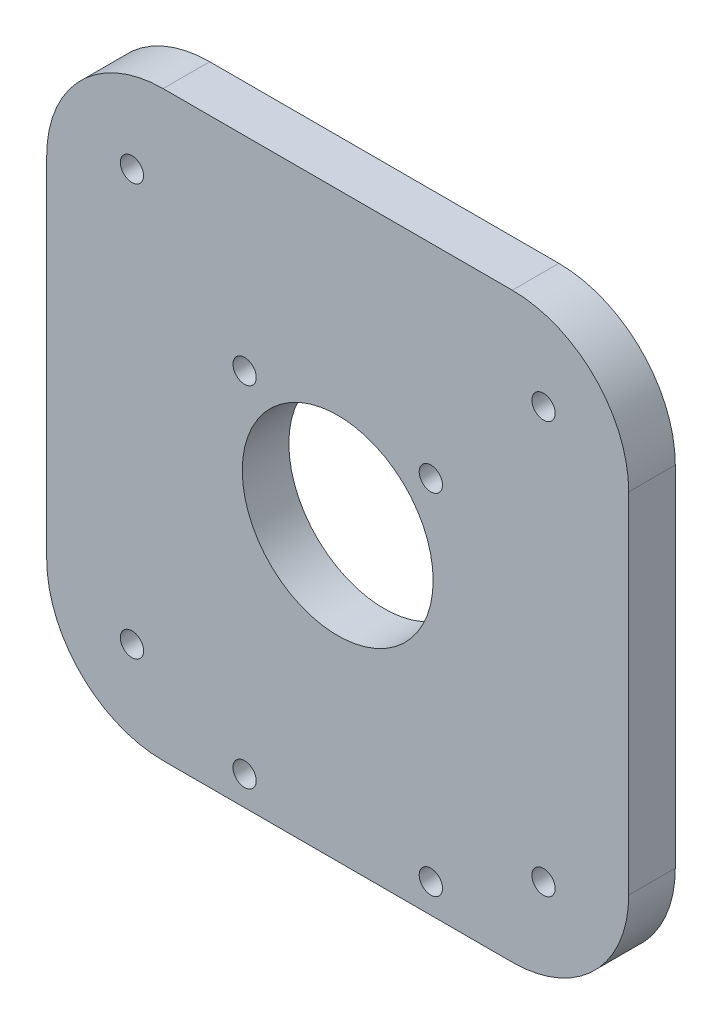
ISO-10303-21;
HEADER;
FILE_DESCRIPTION(('STEP AP214'),'2;1');
FILE_NAME('part.step','',(''),(''),'','','');
FILE_SCHEMA(('AUTOMOTIVE_DESIGN { 1 0 10303 214 1 1 1 1 }'));
ENDSEC;
DATA;
#1=APPLICATION_CONTEXT('core data for automotive mechanical design processes');
#2=APPLICATION_PROTOCOL_DEFINITION('international standard','automotive_design',2000,#1);
#3=PRODUCT_CONTEXT('',#1,'mechanical');
#4=PRODUCT('Part','Part','',(#3));
#5=PRODUCT_RELATED_PRODUCT_CATEGORY('part','',(#4));
#6=PRODUCT_DEFINITION_FORMATION('','',#4);
#7=PRODUCT_DEFINITION_CONTEXT('part definition',#1,'design');
#8=PRODUCT_DEFINITION('design','',#6,#7);
#9=PRODUCT_DEFINITION_SHAPE('','',#8);
#10=(LENGTH_UNIT() NAMED_UNIT(*) SI_UNIT(.MILLI.,.METRE.));
#11=(NAMED_UNIT(*) PLANE_ANGLE_UNIT() SI_UNIT($,.RADIAN.));
#12=(NAMED_UNIT(*) SI_UNIT($,.STERADIAN.) SOLID_ANGLE_UNIT());
#13=UNCERTAINTY_MEASURE_WITH_UNIT(LENGTH_MEASURE(1.E-05),#10,'distance_accuracy_value','');
#14=(GEOMETRIC_REPRESENTATION_CONTEXT(3) GLOBAL_UNCERTAINTY_ASSIGNED_CONTEXT((#13)) GLOBAL_UNIT_ASSIGNED_CONTEXT((#10,
#11,#12)) REPRESENTATION_CONTEXT('',''));
#15=CARTESIAN_POINT('',(0.,0.,0.));
#16=DIRECTION('',(0.,0.,1.));
#17=DIRECTION('',(1.,0.,0.));
#18=AXIS2_PLACEMENT_3D('',#15,#16,#17);
#19=CARTESIAN_POINT('',(25.,-25.,4.));
#20=DIRECTION('',(-1.,0.,0.));
#21=DIRECTION('',(0.,0.,1.));
#22=AXIS2_PLACEMENT_3D('',#19,#20,#21);
#23=PLANE('',#22);
#24=DIRECTION('',(0.,1.,0.));
#25=VECTOR('',#24,1.);
#26=CARTESIAN_POINT('',(25.,-25.,4.));
#27=LINE('',#26,#25);
#28=CARTESIAN_POINT('',(25.,-15.,4.));
#29=VERTEX_POINT('',#28);
#30=CARTESIAN_POINT('',(25.,15.,4.));
#31=VERTEX_POINT('',#30);
#32=EDGE_CURVE('E140',#29,#31,#27,.T.);
#33=ORIENTED_EDGE('',*,*,#32,.F.);
#34=DIRECTION('',(0.,0.,-1.));
#35=VECTOR('',#34,1.);
#36=CARTESIAN_POINT('',(25.,-15.,4.));
#37=LINE('',#36,#35);
#38=CARTESIAN_POINT('',(25.,-15.,0.));
#39=VERTEX_POINT('',#38);
#40=EDGE_CURVE('E201',#29,#39,#37,.T.);
#41=ORIENTED_EDGE('',*,*,#40,.T.);
#42=DIRECTION('',(0.,1.,0.));
#43=VECTOR('',#42,1.);
#44=CARTESIAN_POINT('',(25.,-25.,0.));
#45=LINE('',#44,#43);
#46=CARTESIAN_POINT('',(25.,15.,0.));
#47=VERTEX_POINT('',#46);
#48=EDGE_CURVE('E172',#39,#47,#45,.T.);
#49=ORIENTED_EDGE('',*,*,#48,.T.);
#50=DIRECTION('',(0.,0.,-1.));
#51=VECTOR('',#50,1.);
#52=CARTESIAN_POINT('',(25.,15.,4.));
#53=LINE('',#52,#51);
#54=EDGE_CURVE('E198',#47,#31,#53,.F.);
#55=ORIENTED_EDGE('',*,*,#54,.T.);
#56=EDGE_LOOP('',(#33,#41,#49,#55));
#57=FACE_BOUND('',#56,.T.);
#58=ADVANCED_FACE('F44',(#57),#23,.F.);
#59=CARTESIAN_POINT('',(-25.,25.,4.));
#60=DIRECTION('',(0.,-1.,0.));
#61=DIRECTION('',(0.,0.,-1.));
#62=AXIS2_PLACEMENT_3D('',#59,#60,#61);
#63=PLANE('',#62);
#64=DIRECTION('',(-1.,0.,0.));
#65=VECTOR('',#64,1.);
#66=CARTESIAN_POINT('',(-25.,25.,4.));
#67=LINE('',#66,#65);
#68=CARTESIAN_POINT('',(15.,25.,4.));
#69=VERTEX_POINT('',#68);
#70=CARTESIAN_POINT('',(-15.,25.,4.));
#71=VERTEX_POINT('',#70);
#72=EDGE_CURVE('E145',#69,#71,#67,.T.);
#73=ORIENTED_EDGE('',*,*,#72,.F.);
#74=DIRECTION('',(0.,0.,-1.));
#75=VECTOR('',#74,1.);
#76=CARTESIAN_POINT('',(15.,25.,4.));
#77=LINE('',#76,#75);
#78=CARTESIAN_POINT('',(15.,25.,0.));
#79=VERTEX_POINT('',#78);
#80=EDGE_CURVE('E11',#69,#79,#77,.T.);
#81=ORIENTED_EDGE('',*,*,#80,.T.);
#82=DIRECTION('',(-1.,0.,0.));
#83=VECTOR('',#82,1.);
#84=CARTESIAN_POINT('',(-25.,25.,0.));
#85=LINE('',#84,#83);
#86=CARTESIAN_POINT('',(-15.,25.,0.));
#87=VERTEX_POINT('',#86);
#88=EDGE_CURVE('E147',#79,#87,#85,.T.);
#89=ORIENTED_EDGE('',*,*,#88,.T.);
#90=DIRECTION('',(0.,0.,-1.));
#91=VECTOR('',#90,1.);
#92=CARTESIAN_POINT('',(-15.,25.,4.));
#93=LINE('',#92,#91);
#94=EDGE_CURVE('E53',#87,#71,#93,.F.);
#95=ORIENTED_EDGE('',*,*,#94,.T.);
#96=EDGE_LOOP('',(#73,#81,#89,#95));
#97=FACE_BOUND('',#96,.T.);
#98=ADVANCED_FACE('F220',(#97),#63,.F.);
#99=CARTESIAN_POINT('',(-25.,-25.,4.));
#100=DIRECTION('',(1.,0.,0.));
#101=DIRECTION('',(0.,0.,-1.));
#102=AXIS2_PLACEMENT_3D('',#99,#100,#101);
#103=PLANE('',#102);
#104=DIRECTION('',(0.,-1.,0.));
#105=VECTOR('',#104,1.);
#106=CARTESIAN_POINT('',(-25.,-25.,0.));
#107=LINE('',#106,#105);
#108=CARTESIAN_POINT('',(-25.,15.,0.));
#109=VERTEX_POINT('',#108);
#110=CARTESIAN_POINT('',(-25.,-15.,0.));
#111=VERTEX_POINT('',#110);
#112=EDGE_CURVE('E141',#109,#111,#107,.T.);
#113=ORIENTED_EDGE('',*,*,#112,.T.);
#114=DIRECTION('',(0.,0.,-1.));
#115=VECTOR('',#114,1.);
#116=CARTESIAN_POINT('',(-25.,-15.,4.));
#117=LINE('',#116,#115);
#118=CARTESIAN_POINT('',(-25.,-15.,4.));
#119=VERTEX_POINT('',#118);
#120=EDGE_CURVE('E116',#111,#119,#117,.F.);
#121=ORIENTED_EDGE('',*,*,#120,.T.);
#122=DIRECTION('',(0.,-1.,0.));
#123=VECTOR('',#122,1.);
#124=CARTESIAN_POINT('',(-25.,-25.,4.));
#125=LINE('',#124,#123);
#126=CARTESIAN_POINT('',(-25.,15.,4.));
#127=VERTEX_POINT('',#126);
#128=EDGE_CURVE('E207',#127,#119,#125,.T.);
#129=ORIENTED_EDGE('',*,*,#128,.F.);
#130=DIRECTION('',(0.,0.,-1.));
#131=VECTOR('',#130,1.);
#132=CARTESIAN_POINT('',(-25.,15.,4.));
#133=LINE('',#132,#131);
#134=EDGE_CURVE('E122',#127,#109,#133,.T.);
#135=ORIENTED_EDGE('',*,*,#134,.T.);
#136=EDGE_LOOP('',(#113,#121,#129,#135));
#137=FACE_BOUND('',#136,.T.);
#138=ADVANCED_FACE('F227',(#137),#103,.F.);
#139=CARTESIAN_POINT('',(-25.,-25.,4.));
#140=DIRECTION('',(0.,1.,0.));
#141=DIRECTION('',(0.,0.,1.));
#142=AXIS2_PLACEMENT_3D('',#139,#140,#141);
#143=PLANE('',#142);
#144=DIRECTION('',(1.,0.,0.));
#145=VECTOR('',#144,1.);
#146=CARTESIAN_POINT('',(-25.,-25.,4.));
#147=LINE('',#146,#145);
#148=CARTESIAN_POINT('',(-15.,-25.,4.));
#149=VERTEX_POINT('',#148);
#150=CARTESIAN_POINT('',(15.,-25.,4.));
#151=VERTEX_POINT('',#150);
#152=EDGE_CURVE('E132',#149,#151,#147,.T.);
#153=ORIENTED_EDGE('',*,*,#152,.F.);
#154=DIRECTION('',(0.,0.,-1.));
#155=VECTOR('',#154,1.);
#156=CARTESIAN_POINT('',(-15.,-25.,4.));
#157=LINE('',#156,#155);
#158=CARTESIAN_POINT('',(-15.,-25.,0.));
#159=VERTEX_POINT('',#158);
#160=EDGE_CURVE('E115',#149,#159,#157,.T.);
#161=ORIENTED_EDGE('',*,*,#160,.T.);
#162=DIRECTION('',(1.,0.,0.));
#163=VECTOR('',#162,1.);
#164=CARTESIAN_POINT('',(-25.,-25.,0.));
#165=LINE('',#164,#163);
#166=CARTESIAN_POINT('',(15.,-25.,0.));
#167=VERTEX_POINT('',#166);
#168=EDGE_CURVE('E129',#159,#167,#165,.T.);
#169=ORIENTED_EDGE('',*,*,#168,.T.);
#170=DIRECTION('',(0.,0.,-1.));
#171=VECTOR('',#170,1.);
#172=CARTESIAN_POINT('',(15.,-25.,4.));
#173=LINE('',#172,#171);
#174=EDGE_CURVE('E135',#167,#151,#173,.F.);
#175=ORIENTED_EDGE('',*,*,#174,.T.);
#176=EDGE_LOOP('',(#153,#161,#169,#175));
#177=FACE_BOUND('',#176,.T.);
#178=ADVANCED_FACE('F128',(#177),#143,.F.);
#179=CARTESIAN_POINT('',(0.,0.,4.));
#180=DIRECTION('',(0.,0.,-1.));
#181=DIRECTION('',(-1.,0.,0.));
#182=AXIS2_PLACEMENT_3D('',#179,#180,#181);
#183=PLANE('',#182);
#184=CARTESIAN_POINT('',(-17.6776695296637,-17.6776695296637,4.));
#185=DIRECTION('',(0.,0.,1.));
#186=DIRECTION('',(1.,0.,0.));
#187=AXIS2_PLACEMENT_3D('',#184,#185,#186);
#188=CIRCLE('',#187,1.);
#189=CARTESIAN_POINT('',(-16.6776695296637,-17.6776695296637,4.));
#190=VERTEX_POINT('',#189);
#191=EDGE_CURVE('E410',#190,#190,#188,.T.);
#192=ORIENTED_EDGE('',*,*,#191,.F.);
#193=EDGE_LOOP('',(#192));
#194=FACE_BOUND('',#193,.T.);
#195=CARTESIAN_POINT('',(17.6776695296637,-17.6776695296637,4.));
#196=DIRECTION('',(0.,0.,1.));
#197=DIRECTION('',(1.,0.,0.));
#198=AXIS2_PLACEMENT_3D('',#195,#196,#197);
#199=CIRCLE('',#198,1.00000000000001);
#200=CARTESIAN_POINT('',(18.6776695296637,-17.6776695296637,4.));
#201=VERTEX_POINT('',#200);
#202=EDGE_CURVE('E414',#201,#201,#199,.T.);
#203=ORIENTED_EDGE('',*,*,#202,.F.);
#204=EDGE_LOOP('',(#203));
#205=FACE_BOUND('',#204,.T.);
#206=CARTESIAN_POINT('',(17.6776695296637,17.6776695296637,4.));
#207=DIRECTION('',(0.,0.,1.));
#208=DIRECTION('',(1.,0.,0.));
#209=AXIS2_PLACEMENT_3D('',#206,#207,#208);
#210=CIRCLE('',#209,1.);
#211=CARTESIAN_POINT('',(18.6776695296637,17.6776695296637,4.));
#212=VERTEX_POINT('',#211);
#213=EDGE_CURVE('E418',#212,#212,#210,.T.);
#214=ORIENTED_EDGE('',*,*,#213,.F.);
#215=EDGE_LOOP('',(#214));
#216=FACE_BOUND('',#215,.T.);
#217=CARTESIAN_POINT('',(-17.6776695296637,17.6776695296637,4.));
#218=DIRECTION('',(0.,0.,1.));
#219=DIRECTION('',(1.,0.,0.));
#220=AXIS2_PLACEMENT_3D('',#217,#218,#219);
#221=CIRCLE('',#220,1.00000000000001);
#222=CARTESIAN_POINT('',(-16.6776695296637,17.6776695296637,4.));
#223=VERTEX_POINT('',#222);
#224=EDGE_CURVE('E422',#223,#223,#221,.T.);
#225=ORIENTED_EDGE('',*,*,#224,.F.);
#226=EDGE_LOOP('',(#225));
#227=FACE_BOUND('',#226,.T.);
#228=CARTESIAN_POINT('',(8.,-22.5,4.));
#229=DIRECTION('',(0.,0.,1.));
#230=DIRECTION('',(1.,0.,0.));
#231=AXIS2_PLACEMENT_3D('',#228,#229,#230);
#232=CIRCLE('',#231,1.);
#233=CARTESIAN_POINT('',(9.,-22.5,4.));
#234=VERTEX_POINT('',#233);
#235=EDGE_CURVE('E426',#234,#234,#232,.T.);
#236=ORIENTED_EDGE('',*,*,#235,.F.);
#237=EDGE_LOOP('',(#236));
#238=FACE_BOUND('',#237,.T.);
#239=CARTESIAN_POINT('',(-8.,-22.5,4.));
#240=DIRECTION('',(0.,0.,1.));
#241=DIRECTION('',(1.,0.,0.));
#242=AXIS2_PLACEMENT_3D('',#239,#240,#241);
#243=CIRCLE('',#242,1.);
#244=CARTESIAN_POINT('',(-7.,-22.5,4.));
#245=VERTEX_POINT('',#244);
#246=EDGE_CURVE('E430',#245,#245,#243,.T.);
#247=ORIENTED_EDGE('',*,*,#246,.F.);
#248=EDGE_LOOP('',(#247));
#249=FACE_BOUND('',#248,.T.);
#250=CARTESIAN_POINT('',(8.,7.5,4.));
#251=DIRECTION('',(0.,0.,1.));
#252=DIRECTION('',(1.,0.,0.));
#253=AXIS2_PLACEMENT_3D('',#250,#251,#252);
#254=CIRCLE('',#253,1.);
#255=CARTESIAN_POINT('',(9.,7.5,4.));
#256=VERTEX_POINT('',#255);
#257=EDGE_CURVE('E434',#256,#256,#254,.T.);
#258=ORIENTED_EDGE('',*,*,#257,.F.);
#259=EDGE_LOOP('',(#258));
#260=FACE_BOUND('',#259,.T.);
#261=CARTESIAN_POINT('',(-8.,7.5,4.));
#262=DIRECTION('',(0.,0.,1.));
#263=DIRECTION('',(1.,0.,0.));
#264=AXIS2_PLACEMENT_3D('',#261,#262,#263);
#265=CIRCLE('',#264,1.);
#266=CARTESIAN_POINT('',(-7.,7.5,4.));
#267=VERTEX_POINT('',#266);
#268=EDGE_CURVE('E438',#267,#267,#265,.T.);
#269=ORIENTED_EDGE('',*,*,#268,.F.);
#270=EDGE_LOOP('',(#269));
#271=FACE_BOUND('',#270,.T.);
#272=CARTESIAN_POINT('',(0.,0.,4.));
#273=DIRECTION('',(0.,0.,1.));
#274=DIRECTION('',(1.,0.,0.));
#275=AXIS2_PLACEMENT_3D('',#272,#273,#274);
#276=CIRCLE('',#275,8.2);
#277=CARTESIAN_POINT('',(8.2,0.,4.));
#278=VERTEX_POINT('',#277);
#279=EDGE_CURVE('E156',#278,#278,#276,.T.);
#280=ORIENTED_EDGE('',*,*,#279,.F.);
#281=EDGE_LOOP('',(#280));
#282=FACE_BOUND('',#281,.T.);
#283=ORIENTED_EDGE('',*,*,#128,.T.);
#284=CARTESIAN_POINT('',(-15.,-15.,4.));
#285=DIRECTION('',(0.,0.,-1.));
#286=DIRECTION('',(-1.,0.,0.));
#287=AXIS2_PLACEMENT_3D('',#284,#285,#286);
#288=CIRCLE('',#287,10.);
#289=EDGE_CURVE('E195',#119,#149,#288,.F.);
#290=ORIENTED_EDGE('',*,*,#289,.T.);
#291=ORIENTED_EDGE('',*,*,#152,.T.);
#292=CARTESIAN_POINT('',(15.,-15.,4.));
#293=DIRECTION('',(0.,0.,-1.));
#294=DIRECTION('',(-1.,0.,0.));
#295=AXIS2_PLACEMENT_3D('',#292,#293,#294);
#296=CIRCLE('',#295,10.);
#297=EDGE_CURVE('E192',#151,#29,#296,.F.);
#298=ORIENTED_EDGE('',*,*,#297,.T.);
#299=ORIENTED_EDGE('',*,*,#32,.T.);
#300=CARTESIAN_POINT('',(15.,15.,4.));
#301=DIRECTION('',(0.,0.,-1.));
#302=DIRECTION('',(-1.,0.,0.));
#303=AXIS2_PLACEMENT_3D('',#300,#301,#302);
#304=CIRCLE('',#303,10.);
#305=EDGE_CURVE('E66',#31,#69,#304,.F.);
#306=ORIENTED_EDGE('',*,*,#305,.T.);
#307=ORIENTED_EDGE('',*,*,#72,.T.);
#308=CARTESIAN_POINT('',(-15.,15.,4.));
#309=DIRECTION('',(0.,0.,-1.));
#310=DIRECTION('',(-1.,0.,0.));
#311=AXIS2_PLACEMENT_3D('',#308,#309,#310);
#312=CIRCLE('',#311,10.);
#313=EDGE_CURVE('E187',#71,#127,#312,.F.);
#314=ORIENTED_EDGE('',*,*,#313,.T.);
#315=EDGE_LOOP('',(#283,#290,#291,#298,#299,#306,#307,#314));
#316=FACE_BOUND('',#315,.T.);
#317=ADVANCED_FACE('F225',(#194,#205,#216,#227,#238,#249,#260,#271,#282,#316),#183,.F.);
#318=CARTESIAN_POINT('',(0.,0.,0.));
#319=DIRECTION('',(0.,0.,-1.));
#320=DIRECTION('',(-1.,0.,0.));
#321=AXIS2_PLACEMENT_3D('',#318,#319,#320);
#322=PLANE('',#321);
#323=CARTESIAN_POINT('',(-17.6776695296637,-17.6776695296637,0.));
#324=DIRECTION('',(0.,0.,1.));
#325=DIRECTION('',(1.,0.,0.));
#326=AXIS2_PLACEMENT_3D('',#323,#324,#325);
#327=CIRCLE('',#326,1.);
#328=CARTESIAN_POINT('',(-16.6776695296637,-17.6776695296637,0.));
#329=VERTEX_POINT('',#328);
#330=EDGE_CURVE('E458',#329,#329,#327,.T.);
#331=ORIENTED_EDGE('',*,*,#330,.T.);
#332=EDGE_LOOP('',(#331));
#333=FACE_BOUND('',#332,.T.);
#334=CARTESIAN_POINT('',(17.6776695296637,-17.6776695296637,0.));
#335=DIRECTION('',(0.,0.,1.));
#336=DIRECTION('',(1.,0.,0.));
#337=AXIS2_PLACEMENT_3D('',#334,#335,#336);
#338=CIRCLE('',#337,1.00000000000001);
#339=CARTESIAN_POINT('',(18.6776695296637,-17.6776695296637,0.));
#340=VERTEX_POINT('',#339);
#341=EDGE_CURVE('E464',#340,#340,#338,.T.);
#342=ORIENTED_EDGE('',*,*,#341,.T.);
#343=EDGE_LOOP('',(#342));
#344=FACE_BOUND('',#343,.T.);
#345=CARTESIAN_POINT('',(17.6776695296637,17.6776695296637,0.));
#346=DIRECTION('',(0.,0.,1.));
#347=DIRECTION('',(1.,0.,0.));
#348=AXIS2_PLACEMENT_3D('',#345,#346,#347);
#349=CIRCLE('',#348,1.);
#350=CARTESIAN_POINT('',(18.6776695296637,17.6776695296637,0.));
#351=VERTEX_POINT('',#350);
#352=EDGE_CURVE('E470',#351,#351,#349,.T.);
#353=ORIENTED_EDGE('',*,*,#352,.T.);
#354=EDGE_LOOP('',(#353));
#355=FACE_BOUND('',#354,.T.);
#356=CARTESIAN_POINT('',(-17.6776695296637,17.6776695296637,0.));
#357=DIRECTION('',(0.,0.,1.));
#358=DIRECTION('',(1.,0.,0.));
#359=AXIS2_PLACEMENT_3D('',#356,#357,#358);
#360=CIRCLE('',#359,1.00000000000001);
#361=CARTESIAN_POINT('',(-16.6776695296637,17.6776695296637,0.));
#362=VERTEX_POINT('',#361);
#363=EDGE_CURVE('E448',#362,#362,#360,.T.);
#364=ORIENTED_EDGE('',*,*,#363,.T.);
#365=EDGE_LOOP('',(#364));
#366=FACE_BOUND('',#365,.T.);
#367=CARTESIAN_POINT('',(8.,-22.5,0.));
#368=DIRECTION('',(0.,0.,-1.));
#369=DIRECTION('',(-1.,0.,0.));
#370=AXIS2_PLACEMENT_3D('',#367,#368,#369);
#371=CIRCLE('',#370,1.);
#372=CARTESIAN_POINT('',(6.99999999999999,-22.5,0.));
#373=VERTEX_POINT('',#372);
#374=EDGE_CURVE('E168',#373,#373,#371,.T.);
#375=ORIENTED_EDGE('',*,*,#374,.F.);
#376=EDGE_LOOP('',(#375));
#377=FACE_BOUND('',#376,.T.);
#378=CARTESIAN_POINT('',(-8.,-22.5,0.));
#379=DIRECTION('',(0.,0.,-1.));
#380=DIRECTION('',(-1.,0.,0.));
#381=AXIS2_PLACEMENT_3D('',#378,#379,#380);
#382=CIRCLE('',#381,1.);
#383=CARTESIAN_POINT('',(-9.,-22.5,0.));
#384=VERTEX_POINT('',#383);
#385=EDGE_CURVE('E164',#384,#384,#382,.T.);
#386=ORIENTED_EDGE('',*,*,#385,.F.);
#387=EDGE_LOOP('',(#386));
#388=FACE_BOUND('',#387,.T.);
#389=CARTESIAN_POINT('',(8.,7.5,0.));
#390=DIRECTION('',(0.,0.,-1.));
#391=DIRECTION('',(-1.,0.,0.));
#392=AXIS2_PLACEMENT_3D('',#389,#390,#391);
#393=CIRCLE('',#392,1.);
#394=CARTESIAN_POINT('',(7.,7.5,0.));
#395=VERTEX_POINT('',#394);
#396=EDGE_CURVE('E160',#395,#395,#393,.T.);
#397=ORIENTED_EDGE('',*,*,#396,.F.);
#398=EDGE_LOOP('',(#397));
#399=FACE_BOUND('',#398,.T.);
#400=CARTESIAN_POINT('',(-8.,7.5,0.));
#401=DIRECTION('',(0.,0.,-1.));
#402=DIRECTION('',(-1.,0.,0.));
#403=AXIS2_PLACEMENT_3D('',#400,#401,#402);
#404=CIRCLE('',#403,1.);
#405=CARTESIAN_POINT('',(-9.,7.5,0.));
#406=VERTEX_POINT('',#405);
#407=EDGE_CURVE('E155',#406,#406,#404,.T.);
#408=ORIENTED_EDGE('',*,*,#407,.F.);
#409=EDGE_LOOP('',(#408));
#410=FACE_BOUND('',#409,.T.);
#411=CARTESIAN_POINT('',(0.,0.,0.));
#412=DIRECTION('',(0.,0.,-1.));
#413=DIRECTION('',(-1.,0.,0.));
#414=AXIS2_PLACEMENT_3D('',#411,#412,#413);
#415=CIRCLE('',#414,8.2);
#416=CARTESIAN_POINT('',(-8.2,0.,0.));
#417=VERTEX_POINT('',#416);
#418=EDGE_CURVE('E151',#417,#417,#415,.T.);
#419=ORIENTED_EDGE('',*,*,#418,.F.);
#420=EDGE_LOOP('',(#419));
#421=FACE_BOUND('',#420,.T.);
#422=ORIENTED_EDGE('',*,*,#168,.F.);
#423=CARTESIAN_POINT('',(-15.,-15.,0.));
#424=DIRECTION('',(0.,0.,-1.));
#425=DIRECTION('',(-1.,0.,0.));
#426=AXIS2_PLACEMENT_3D('',#423,#424,#425);
#427=CIRCLE('',#426,10.);
#428=EDGE_CURVE('E111',#159,#111,#427,.T.);
#429=ORIENTED_EDGE('',*,*,#428,.T.);
#430=ORIENTED_EDGE('',*,*,#112,.F.);
#431=CARTESIAN_POINT('',(-15.,15.,0.));
#432=DIRECTION('',(0.,0.,-1.));
#433=DIRECTION('',(-1.,0.,0.));
#434=AXIS2_PLACEMENT_3D('',#431,#432,#433);
#435=CIRCLE('',#434,10.);
#436=EDGE_CURVE('E134',#109,#87,#435,.T.);
#437=ORIENTED_EDGE('',*,*,#436,.T.);
#438=ORIENTED_EDGE('',*,*,#88,.F.);
#439=CARTESIAN_POINT('',(15.,15.,0.));
#440=DIRECTION('',(0.,0.,-1.));
#441=DIRECTION('',(-1.,0.,0.));
#442=AXIS2_PLACEMENT_3D('',#439,#440,#441);
#443=CIRCLE('',#442,10.);
#444=EDGE_CURVE('E177',#79,#47,#443,.T.);
#445=ORIENTED_EDGE('',*,*,#444,.T.);
#446=ORIENTED_EDGE('',*,*,#48,.F.);
#447=CARTESIAN_POINT('',(15.,-15.,0.));
#448=DIRECTION('',(0.,0.,-1.));
#449=DIRECTION('',(-1.,0.,0.));
#450=AXIS2_PLACEMENT_3D('',#447,#448,#449);
#451=CIRCLE('',#450,10.);
#452=EDGE_CURVE('E123',#39,#167,#451,.T.);
#453=ORIENTED_EDGE('',*,*,#452,.T.);
#454=EDGE_LOOP('',(#422,#429,#430,#437,#438,#445,#446,#453));
#455=FACE_BOUND('',#454,.T.);
#456=ADVANCED_FACE('F137',(#333,#344,#355,#366,#377,#388,#399,#410,#421,#455),#322,.T.);
#457=CARTESIAN_POINT('',(0.,0.,-6.));
#458=DIRECTION('',(0.,0.,1.));
#459=DIRECTION('',(1.,0.,0.));
#460=AXIS2_PLACEMENT_3D('',#457,#458,#459);
#461=CYLINDRICAL_SURFACE('',#460,8.2);
#462=ORIENTED_EDGE('',*,*,#418,.T.);
#463=EDGE_LOOP('',(#462));
#464=FACE_BOUND('',#463,.T.);
#465=ORIENTED_EDGE('',*,*,#279,.T.);
#466=EDGE_LOOP('',(#465));
#467=FACE_BOUND('',#466,.T.);
#468=ADVANCED_FACE('F357',(#464,#467),#461,.F.);
#469=CARTESIAN_POINT('',(-8.,7.5,-6.));
#470=DIRECTION('',(0.,0.,1.));
#471=DIRECTION('',(1.,0.,0.));
#472=AXIS2_PLACEMENT_3D('',#469,#470,#471);
#473=CYLINDRICAL_SURFACE('',#472,1.);
#474=ORIENTED_EDGE('',*,*,#407,.T.);
#475=EDGE_LOOP('',(#474));
#476=FACE_BOUND('',#475,.T.);
#477=ORIENTED_EDGE('',*,*,#268,.T.);
#478=EDGE_LOOP('',(#477));
#479=FACE_BOUND('',#478,.T.);
#480=ADVANCED_FACE('F347',(#476,#479),#473,.F.);
#481=CARTESIAN_POINT('',(8.,7.5,-6.));
#482=DIRECTION('',(0.,0.,1.));
#483=DIRECTION('',(1.,0.,0.));
#484=AXIS2_PLACEMENT_3D('',#481,#482,#483);
#485=CYLINDRICAL_SURFACE('',#484,1.);
#486=ORIENTED_EDGE('',*,*,#396,.T.);
#487=EDGE_LOOP('',(#486));
#488=FACE_BOUND('',#487,.T.);
#489=ORIENTED_EDGE('',*,*,#257,.T.);
#490=EDGE_LOOP('',(#489));
#491=FACE_BOUND('',#490,.T.);
#492=ADVANCED_FACE('F337',(#488,#491),#485,.F.);
#493=CARTESIAN_POINT('',(-8.,-22.5,-6.));
#494=DIRECTION('',(0.,0.,1.));
#495=DIRECTION('',(1.,0.,0.));
#496=AXIS2_PLACEMENT_3D('',#493,#494,#495);
#497=CYLINDRICAL_SURFACE('',#496,1.);
#498=ORIENTED_EDGE('',*,*,#385,.T.);
#499=EDGE_LOOP('',(#498));
#500=FACE_BOUND('',#499,.T.);
#501=ORIENTED_EDGE('',*,*,#246,.T.);
#502=EDGE_LOOP('',(#501));
#503=FACE_BOUND('',#502,.T.);
#504=ADVANCED_FACE('F327',(#500,#503),#497,.F.);
#505=CARTESIAN_POINT('',(8.,-22.5,-6.));
#506=DIRECTION('',(0.,0.,1.));
#507=DIRECTION('',(1.,0.,0.));
#508=AXIS2_PLACEMENT_3D('',#505,#506,#507);
#509=CYLINDRICAL_SURFACE('',#508,1.);
#510=ORIENTED_EDGE('',*,*,#374,.T.);
#511=EDGE_LOOP('',(#510));
#512=FACE_BOUND('',#511,.T.);
#513=ORIENTED_EDGE('',*,*,#235,.T.);
#514=EDGE_LOOP('',(#513));
#515=FACE_BOUND('',#514,.T.);
#516=ADVANCED_FACE('F317',(#512,#515),#509,.F.);
#517=CARTESIAN_POINT('',(-17.6776695296637,17.6776695296637,0.));
#518=DIRECTION('',(0.,0.,1.));
#519=DIRECTION('',(1.,0.,0.));
#520=AXIS2_PLACEMENT_3D('',#517,#518,#519);
#521=CYLINDRICAL_SURFACE('',#520,1.00000000000001);
#522=ORIENTED_EDGE('',*,*,#363,.F.);
#523=EDGE_LOOP('',(#522));
#524=FACE_BOUND('',#523,.T.);
#525=ORIENTED_EDGE('',*,*,#224,.T.);
#526=EDGE_LOOP('',(#525));
#527=FACE_BOUND('',#526,.T.);
#528=ADVANCED_FACE('F307',(#524,#527),#521,.F.);
#529=CARTESIAN_POINT('',(17.6776695296637,17.6776695296637,0.));
#530=DIRECTION('',(0.,0.,1.));
#531=DIRECTION('',(1.,0.,0.));
#532=AXIS2_PLACEMENT_3D('',#529,#530,#531);
#533=CYLINDRICAL_SURFACE('',#532,1.);
#534=ORIENTED_EDGE('',*,*,#352,.F.);
#535=EDGE_LOOP('',(#534));
#536=FACE_BOUND('',#535,.T.);
#537=ORIENTED_EDGE('',*,*,#213,.T.);
#538=EDGE_LOOP('',(#537));
#539=FACE_BOUND('',#538,.T.);
#540=ADVANCED_FACE('F297',(#536,#539),#533,.F.);
#541=CARTESIAN_POINT('',(17.6776695296637,-17.6776695296637,0.));
#542=DIRECTION('',(0.,0.,1.));
#543=DIRECTION('',(1.,0.,0.));
#544=AXIS2_PLACEMENT_3D('',#541,#542,#543);
#545=CYLINDRICAL_SURFACE('',#544,1.00000000000001);
#546=ORIENTED_EDGE('',*,*,#341,.F.);
#547=EDGE_LOOP('',(#546));
#548=FACE_BOUND('',#547,.T.);
#549=ORIENTED_EDGE('',*,*,#202,.T.);
#550=EDGE_LOOP('',(#549));
#551=FACE_BOUND('',#550,.T.);
#552=ADVANCED_FACE('F287',(#548,#551),#545,.F.);
#553=CARTESIAN_POINT('',(-17.6776695296637,-17.6776695296637,0.));
#554=DIRECTION('',(0.,0.,1.));
#555=DIRECTION('',(1.,0.,0.));
#556=AXIS2_PLACEMENT_3D('',#553,#554,#555);
#557=CYLINDRICAL_SURFACE('',#556,1.);
#558=ORIENTED_EDGE('',*,*,#330,.F.);
#559=EDGE_LOOP('',(#558));
#560=FACE_BOUND('',#559,.T.);
#561=ORIENTED_EDGE('',*,*,#191,.T.);
#562=EDGE_LOOP('',(#561));
#563=FACE_BOUND('',#562,.T.);
#564=ADVANCED_FACE('F247',(#560,#563),#557,.F.);
#565=CARTESIAN_POINT('',(-15.,-15.,4.));
#566=DIRECTION('',(0.,0.,-1.));
#567=DIRECTION('',(-1.,0.,0.));
#568=AXIS2_PLACEMENT_3D('',#565,#566,#567);
#569=CYLINDRICAL_SURFACE('',#568,10.);
#570=ORIENTED_EDGE('',*,*,#289,.F.);
#571=ORIENTED_EDGE('',*,*,#120,.F.);
#572=ORIENTED_EDGE('',*,*,#428,.F.);
#573=ORIENTED_EDGE('',*,*,#160,.F.);
#574=EDGE_LOOP('',(#570,#571,#572,#573));
#575=FACE_BOUND('',#574,.T.);
#576=ADVANCED_FACE('F114',(#575),#569,.T.);
#577=CARTESIAN_POINT('',(15.,-15.,4.));
#578=DIRECTION('',(0.,0.,-1.));
#579=DIRECTION('',(-1.,0.,0.));
#580=AXIS2_PLACEMENT_3D('',#577,#578,#579);
#581=CYLINDRICAL_SURFACE('',#580,10.);
#582=ORIENTED_EDGE('',*,*,#297,.F.);
#583=ORIENTED_EDGE('',*,*,#174,.F.);
#584=ORIENTED_EDGE('',*,*,#452,.F.);
#585=ORIENTED_EDGE('',*,*,#40,.F.);
#586=EDGE_LOOP('',(#582,#583,#584,#585));
#587=FACE_BOUND('',#586,.T.);
#588=ADVANCED_FACE('F246',(#587),#581,.T.);
#589=CARTESIAN_POINT('',(15.,15.,4.));
#590=DIRECTION('',(0.,0.,-1.));
#591=DIRECTION('',(-1.,0.,0.));
#592=AXIS2_PLACEMENT_3D('',#589,#590,#591);
#593=CYLINDRICAL_SURFACE('',#592,10.);
#594=ORIENTED_EDGE('',*,*,#305,.F.);
#595=ORIENTED_EDGE('',*,*,#54,.F.);
#596=ORIENTED_EDGE('',*,*,#444,.F.);
#597=ORIENTED_EDGE('',*,*,#80,.F.);
#598=EDGE_LOOP('',(#594,#595,#596,#597));
#599=FACE_BOUND('',#598,.T.);
#600=ADVANCED_FACE('F249',(#599),#593,.T.);
#601=CARTESIAN_POINT('',(-15.,15.,4.));
#602=DIRECTION('',(0.,0.,-1.));
#603=DIRECTION('',(-1.,0.,0.));
#604=AXIS2_PLACEMENT_3D('',#601,#602,#603);
#605=CYLINDRICAL_SURFACE('',#604,10.);
#606=ORIENTED_EDGE('',*,*,#313,.F.);
#607=ORIENTED_EDGE('',*,*,#94,.F.);
#608=ORIENTED_EDGE('',*,*,#436,.F.);
#609=ORIENTED_EDGE('',*,*,#134,.F.);
#610=EDGE_LOOP('',(#606,#607,#608,#609));
#611=FACE_BOUND('',#610,.T.);
#612=ADVANCED_FACE('F46',(#611),#605,.T.);
#613=CLOSED_SHELL('',(#58,#98,#138,#178,#317,#456,#468,#480,#492,#504,#516,#528,#540,#552,#564,
#576,#588,#600,#612));
#614=MANIFOLD_SOLID_BREP('B2',#613);
#615=ADVANCED_BREP_SHAPE_REPRESENTATION('',(#18,#614),#14);
#616=SHAPE_DEFINITION_REPRESENTATION(#9,#615);
ENDSEC;
END-ISO-10303-21;
